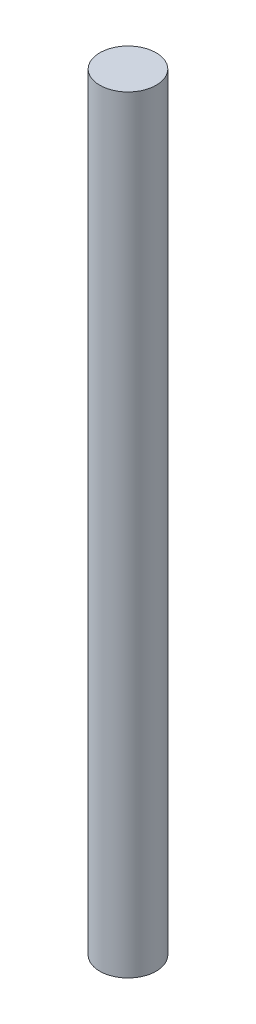
ISO-10303-21;
HEADER;
FILE_DESCRIPTION(('STEP AP214'),'2;1');
FILE_NAME('part.step','',(''),(''),'','','');
FILE_SCHEMA(('AUTOMOTIVE_DESIGN { 1 0 10303 214 1 1 1 1 }'));
ENDSEC;
DATA;
#1=APPLICATION_CONTEXT('core data for automotive mechanical design processes');
#2=APPLICATION_PROTOCOL_DEFINITION('international standard','automotive_design',2000,#1);
#3=PRODUCT_CONTEXT('',#1,'mechanical');
#4=PRODUCT('Part','Part','',(#3));
#5=PRODUCT_RELATED_PRODUCT_CATEGORY('part','',(#4));
#6=PRODUCT_DEFINITION_FORMATION('','',#4);
#7=PRODUCT_DEFINITION_CONTEXT('part definition',#1,'design');
#8=PRODUCT_DEFINITION('design','',#6,#7);
#9=PRODUCT_DEFINITION_SHAPE('','',#8);
#10=(LENGTH_UNIT() NAMED_UNIT(*) SI_UNIT(.MILLI.,.METRE.));
#11=(NAMED_UNIT(*) PLANE_ANGLE_UNIT() SI_UNIT($,.RADIAN.));
#12=(NAMED_UNIT(*) SI_UNIT($,.STERADIAN.) SOLID_ANGLE_UNIT());
#13=UNCERTAINTY_MEASURE_WITH_UNIT(LENGTH_MEASURE(1.E-05),#10,'distance_accuracy_value','');
#14=(GEOMETRIC_REPRESENTATION_CONTEXT(3) GLOBAL_UNCERTAINTY_ASSIGNED_CONTEXT((#13)) GLOBAL_UNIT_ASSIGNED_CONTEXT((#10,
#11,#12)) REPRESENTATION_CONTEXT('',''));
#15=CARTESIAN_POINT('',(0.,0.,0.));
#16=DIRECTION('',(0.,0.,1.));
#17=DIRECTION('',(1.,0.,0.));
#18=AXIS2_PLACEMENT_3D('',#15,#16,#17);
#19=CARTESIAN_POINT('',(0.,2200.,0.));
#20=DIRECTION('',(0.,-1.,0.));
#21=DIRECTION('',(0.,0.,-1.));
#22=AXIS2_PLACEMENT_3D('',#19,#20,#21);
#23=CYLINDRICAL_SURFACE('',#22,80.75);
#24=CARTESIAN_POINT('',(0.,2200.,0.));
#25=DIRECTION('',(0.,1.,0.));
#26=DIRECTION('',(0.,0.,1.));
#27=AXIS2_PLACEMENT_3D('',#24,#25,#26);
#28=CIRCLE('',#27,80.75);
#29=CARTESIAN_POINT('',(0.,2200.,80.75));
#30=VERTEX_POINT('',#29);
#31=EDGE_CURVE('E10',#30,#30,#28,.T.);
#32=ORIENTED_EDGE('',*,*,#31,.F.);
#33=EDGE_LOOP('',(#32));
#34=FACE_BOUND('',#33,.T.);
#35=CARTESIAN_POINT('',(0.,0.,0.));
#36=DIRECTION('',(0.,1.,0.));
#37=DIRECTION('',(0.,0.,1.));
#38=AXIS2_PLACEMENT_3D('',#35,#36,#37);
#39=CIRCLE('',#38,80.75);
#40=CARTESIAN_POINT('',(0.,0.,80.75));
#41=VERTEX_POINT('',#40);
#42=EDGE_CURVE('E37',#41,#41,#39,.T.);
#43=ORIENTED_EDGE('',*,*,#42,.T.);
#44=EDGE_LOOP('',(#43));
#45=FACE_BOUND('',#44,.T.);
#46=ADVANCED_FACE('F34',(#34,#45),#23,.T.);
#47=CARTESIAN_POINT('',(0.,2200.,0.));
#48=DIRECTION('',(0.,1.,0.));
#49=DIRECTION('',(0.,0.,1.));
#50=AXIS2_PLACEMENT_3D('',#47,#48,#49);
#51=PLANE('',#50);
#52=ORIENTED_EDGE('',*,*,#31,.T.);
#53=EDGE_LOOP('',(#52));
#54=FACE_BOUND('',#53,.T.);
#55=ADVANCED_FACE('F49',(#54),#51,.T.);
#56=CARTESIAN_POINT('',(0.,0.,0.));
#57=DIRECTION('',(0.,1.,0.));
#58=DIRECTION('',(0.,0.,1.));
#59=AXIS2_PLACEMENT_3D('',#56,#57,#58);
#60=PLANE('',#59);
#61=ORIENTED_EDGE('',*,*,#42,.F.);
#62=EDGE_LOOP('',(#61));
#63=FACE_BOUND('',#62,.T.);
#64=ADVANCED_FACE('F47',(#63),#60,.F.);
#65=CLOSED_SHELL('',(#46,#55,#64));
#66=MANIFOLD_SOLID_BREP('B2',#65);
#67=ADVANCED_BREP_SHAPE_REPRESENTATION('',(#18,#66),#14);
#68=SHAPE_DEFINITION_REPRESENTATION(#9,#67);
ENDSEC;
END-ISO-10303-21;
